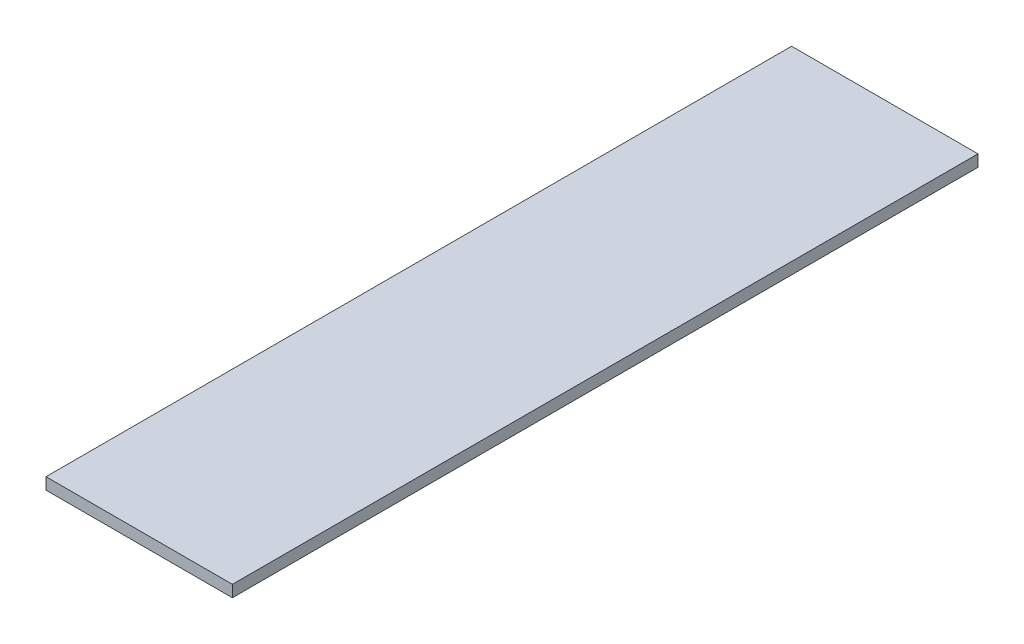
ISO-10303-21;
HEADER;
FILE_DESCRIPTION(('STEP AP214'),'2;1');
FILE_NAME('part.step','',(''),(''),'','','');
FILE_SCHEMA(('AUTOMOTIVE_DESIGN { 1 0 10303 214 1 1 1 1 }'));
ENDSEC;
DATA;
#1=APPLICATION_CONTEXT('core data for automotive mechanical design processes');
#2=APPLICATION_PROTOCOL_DEFINITION('international standard','automotive_design',2000,#1);
#3=PRODUCT_CONTEXT('',#1,'mechanical');
#4=PRODUCT('Part','Part','',(#3));
#5=PRODUCT_RELATED_PRODUCT_CATEGORY('part','',(#4));
#6=PRODUCT_DEFINITION_FORMATION('','',#4);
#7=PRODUCT_DEFINITION_CONTEXT('part definition',#1,'design');
#8=PRODUCT_DEFINITION('design','',#6,#7);
#9=PRODUCT_DEFINITION_SHAPE('','',#8);
#10=(LENGTH_UNIT() NAMED_UNIT(*) SI_UNIT(.MILLI.,.METRE.));
#11=(NAMED_UNIT(*) PLANE_ANGLE_UNIT() SI_UNIT($,.RADIAN.));
#12=(NAMED_UNIT(*) SI_UNIT($,.STERADIAN.) SOLID_ANGLE_UNIT());
#13=UNCERTAINTY_MEASURE_WITH_UNIT(LENGTH_MEASURE(1.E-05),#10,'distance_accuracy_value','');
#14=(GEOMETRIC_REPRESENTATION_CONTEXT(3) GLOBAL_UNCERTAINTY_ASSIGNED_CONTEXT((#13)) GLOBAL_UNIT_ASSIGNED_CONTEXT((#10,
#11,#12)) REPRESENTATION_CONTEXT('',''));
#15=CARTESIAN_POINT('',(0.,0.,0.));
#16=DIRECTION('',(0.,0.,1.));
#17=DIRECTION('',(1.,0.,0.));
#18=AXIS2_PLACEMENT_3D('',#15,#16,#17);
#19=CARTESIAN_POINT('',(-12.7,1.5875,-50.8));
#20=DIRECTION('',(1.,0.,0.));
#21=DIRECTION('',(0.,0.,-1.));
#22=AXIS2_PLACEMENT_3D('',#19,#20,#21);
#23=PLANE('',#22);
#24=DIRECTION('',(0.,0.,1.));
#25=VECTOR('',#24,1.);
#26=CARTESIAN_POINT('',(-12.7,0.,-50.8));
#27=LINE('',#26,#25);
#28=CARTESIAN_POINT('',(-12.7,0.,-50.8));
#29=VERTEX_POINT('',#28);
#30=CARTESIAN_POINT('',(-12.7,0.,50.8));
#31=VERTEX_POINT('',#30);
#32=EDGE_CURVE('E96',#29,#31,#27,.T.);
#33=ORIENTED_EDGE('',*,*,#32,.T.);
#34=DIRECTION('',(0.,-1.,0.));
#35=VECTOR('',#34,1.);
#36=CARTESIAN_POINT('',(-12.7,1.5875,50.8));
#37=LINE('',#36,#35);
#38=CARTESIAN_POINT('',(-12.7,1.5875,50.8));
#39=VERTEX_POINT('',#38);
#40=EDGE_CURVE('E11',#39,#31,#37,.T.);
#41=ORIENTED_EDGE('',*,*,#40,.F.);
#42=DIRECTION('',(0.,0.,1.));
#43=VECTOR('',#42,1.);
#44=CARTESIAN_POINT('',(-12.7,1.5875,-50.8));
#45=LINE('',#44,#43);
#46=CARTESIAN_POINT('',(-12.7,1.5875,-50.8));
#47=VERTEX_POINT('',#46);
#48=EDGE_CURVE('E84',#47,#39,#45,.T.);
#49=ORIENTED_EDGE('',*,*,#48,.F.);
#50=DIRECTION('',(0.,-1.,0.));
#51=VECTOR('',#50,1.);
#52=CARTESIAN_POINT('',(-12.7,1.5875,-50.8));
#53=LINE('',#52,#51);
#54=EDGE_CURVE('E92',#47,#29,#53,.T.);
#55=ORIENTED_EDGE('',*,*,#54,.T.);
#56=EDGE_LOOP('',(#33,#41,#49,#55));
#57=FACE_BOUND('',#56,.T.);
#58=ADVANCED_FACE('F33',(#57),#23,.F.);
#59=CARTESIAN_POINT('',(12.7,1.5875,50.8));
#60=DIRECTION('',(0.,0.,-1.));
#61=DIRECTION('',(-1.,0.,0.));
#62=AXIS2_PLACEMENT_3D('',#59,#60,#61);
#63=PLANE('',#62);
#64=DIRECTION('',(1.,0.,0.));
#65=VECTOR('',#64,1.);
#66=CARTESIAN_POINT('',(12.7,0.,50.8));
#67=LINE('',#66,#65);
#68=CARTESIAN_POINT('',(12.7,0.,50.8));
#69=VERTEX_POINT('',#68);
#70=EDGE_CURVE('E88',#31,#69,#67,.T.);
#71=ORIENTED_EDGE('',*,*,#70,.T.);
#72=DIRECTION('',(0.,-1.,0.));
#73=VECTOR('',#72,1.);
#74=CARTESIAN_POINT('',(12.7,1.5875,50.8));
#75=LINE('',#74,#73);
#76=CARTESIAN_POINT('',(12.7,1.5875,50.8));
#77=VERTEX_POINT('',#76);
#78=EDGE_CURVE('E41',#77,#69,#75,.T.);
#79=ORIENTED_EDGE('',*,*,#78,.F.);
#80=DIRECTION('',(1.,0.,0.));
#81=VECTOR('',#80,1.);
#82=CARTESIAN_POINT('',(12.7,1.5875,50.8));
#83=LINE('',#82,#81);
#84=EDGE_CURVE('E79',#39,#77,#83,.T.);
#85=ORIENTED_EDGE('',*,*,#84,.F.);
#86=ORIENTED_EDGE('',*,*,#40,.T.);
#87=EDGE_LOOP('',(#71,#79,#85,#86));
#88=FACE_BOUND('',#87,.T.);
#89=ADVANCED_FACE('F87',(#88),#63,.F.);
#90=CARTESIAN_POINT('',(12.7,1.5875,-50.8));
#91=DIRECTION('',(-1.,0.,0.));
#92=DIRECTION('',(0.,0.,1.));
#93=AXIS2_PLACEMENT_3D('',#90,#91,#92);
#94=PLANE('',#93);
#95=DIRECTION('',(0.,0.,-1.));
#96=VECTOR('',#95,1.);
#97=CARTESIAN_POINT('',(12.7,0.,-50.8));
#98=LINE('',#97,#96);
#99=CARTESIAN_POINT('',(12.7,0.,-50.8));
#100=VERTEX_POINT('',#99);
#101=EDGE_CURVE('E66',#69,#100,#98,.T.);
#102=ORIENTED_EDGE('',*,*,#101,.T.);
#103=DIRECTION('',(0.,-1.,0.));
#104=VECTOR('',#103,1.);
#105=CARTESIAN_POINT('',(12.7,1.5875,-50.8));
#106=LINE('',#105,#104);
#107=CARTESIAN_POINT('',(12.7,1.5875,-50.8));
#108=VERTEX_POINT('',#107);
#109=EDGE_CURVE('E89',#108,#100,#106,.T.);
#110=ORIENTED_EDGE('',*,*,#109,.F.);
#111=DIRECTION('',(0.,0.,-1.));
#112=VECTOR('',#111,1.);
#113=CARTESIAN_POINT('',(12.7,1.5875,-50.8));
#114=LINE('',#113,#112);
#115=EDGE_CURVE('E82',#77,#108,#114,.T.);
#116=ORIENTED_EDGE('',*,*,#115,.F.);
#117=ORIENTED_EDGE('',*,*,#78,.T.);
#118=EDGE_LOOP('',(#102,#110,#116,#117));
#119=FACE_BOUND('',#118,.T.);
#120=ADVANCED_FACE('F90',(#119),#94,.F.);
#121=CARTESIAN_POINT('',(12.7,1.5875,-50.8));
#122=DIRECTION('',(0.,0.,1.));
#123=DIRECTION('',(1.,0.,0.));
#124=AXIS2_PLACEMENT_3D('',#121,#122,#123);
#125=PLANE('',#124);
#126=DIRECTION('',(-1.,0.,0.));
#127=VECTOR('',#126,1.);
#128=CARTESIAN_POINT('',(12.7,0.,-50.8));
#129=LINE('',#128,#127);
#130=EDGE_CURVE('E72',#100,#29,#129,.T.);
#131=ORIENTED_EDGE('',*,*,#130,.T.);
#132=ORIENTED_EDGE('',*,*,#54,.F.);
#133=DIRECTION('',(-1.,0.,0.));
#134=VECTOR('',#133,1.);
#135=CARTESIAN_POINT('',(12.7,1.5875,-50.8));
#136=LINE('',#135,#134);
#137=EDGE_CURVE('E49',#108,#47,#136,.T.);
#138=ORIENTED_EDGE('',*,*,#137,.F.);
#139=ORIENTED_EDGE('',*,*,#109,.T.);
#140=EDGE_LOOP('',(#131,#132,#138,#139));
#141=FACE_BOUND('',#140,.T.);
#142=ADVANCED_FACE('F103',(#141),#125,.F.);
#143=CARTESIAN_POINT('',(0.,1.5875,0.));
#144=DIRECTION('',(0.,-1.,0.));
#145=DIRECTION('',(0.,0.,-1.));
#146=AXIS2_PLACEMENT_3D('',#143,#144,#145);
#147=PLANE('',#146);
#148=ORIENTED_EDGE('',*,*,#48,.T.);
#149=ORIENTED_EDGE('',*,*,#84,.T.);
#150=ORIENTED_EDGE('',*,*,#115,.T.);
#151=ORIENTED_EDGE('',*,*,#137,.T.);
#152=EDGE_LOOP('',(#148,#149,#150,#151));
#153=FACE_BOUND('',#152,.T.);
#154=ADVANCED_FACE('F80',(#153),#147,.F.);
#155=CARTESIAN_POINT('',(0.,0.,0.));
#156=DIRECTION('',(0.,-1.,0.));
#157=DIRECTION('',(0.,0.,-1.));
#158=AXIS2_PLACEMENT_3D('',#155,#156,#157);
#159=PLANE('',#158);
#160=ORIENTED_EDGE('',*,*,#32,.F.);
#161=ORIENTED_EDGE('',*,*,#130,.F.);
#162=ORIENTED_EDGE('',*,*,#101,.F.);
#163=ORIENTED_EDGE('',*,*,#70,.F.);
#164=EDGE_LOOP('',(#160,#161,#162,#163));
#165=FACE_BOUND('',#164,.T.);
#166=ADVANCED_FACE('F106',(#165),#159,.T.);
#167=CLOSED_SHELL('',(#58,#89,#120,#142,#154,#166));
#168=MANIFOLD_SOLID_BREP('B2',#167);
#169=ADVANCED_BREP_SHAPE_REPRESENTATION('',(#18,#168),#14);
#170=SHAPE_DEFINITION_REPRESENTATION(#9,#169);
ENDSEC;
END-ISO-10303-21;
